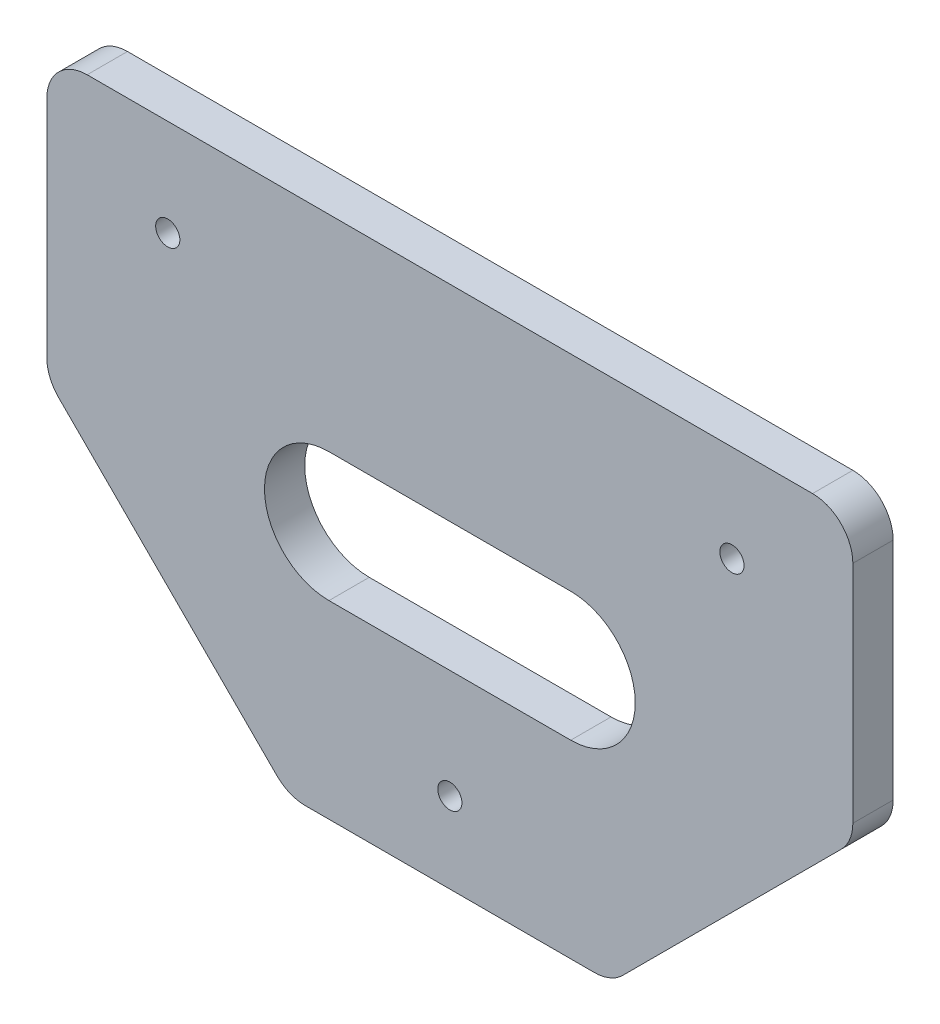
ISO-10303-21;
HEADER;
FILE_DESCRIPTION(('STEP AP214'),'2;1');
FILE_NAME('part.step','',(''),(''),'','','');
FILE_SCHEMA(('AUTOMOTIVE_DESIGN { 1 0 10303 214 1 1 1 1 }'));
ENDSEC;
DATA;
#1=APPLICATION_CONTEXT('core data for automotive mechanical design processes');
#2=APPLICATION_PROTOCOL_DEFINITION('international standard','automotive_design',2000,#1);
#3=PRODUCT_CONTEXT('',#1,'mechanical');
#4=PRODUCT('Part','Part','',(#3));
#5=PRODUCT_RELATED_PRODUCT_CATEGORY('part','',(#4));
#6=PRODUCT_DEFINITION_FORMATION('','',#4);
#7=PRODUCT_DEFINITION_CONTEXT('part definition',#1,'design');
#8=PRODUCT_DEFINITION('design','',#6,#7);
#9=PRODUCT_DEFINITION_SHAPE('','',#8);
#10=(LENGTH_UNIT() NAMED_UNIT(*) SI_UNIT(.MILLI.,.METRE.));
#11=(NAMED_UNIT(*) PLANE_ANGLE_UNIT() SI_UNIT($,.RADIAN.));
#12=(NAMED_UNIT(*) SI_UNIT($,.STERADIAN.) SOLID_ANGLE_UNIT());
#13=UNCERTAINTY_MEASURE_WITH_UNIT(LENGTH_MEASURE(1.E-05),#10,'distance_accuracy_value','');
#14=(GEOMETRIC_REPRESENTATION_CONTEXT(3) GLOBAL_UNCERTAINTY_ASSIGNED_CONTEXT((#13)) GLOBAL_UNIT_ASSIGNED_CONTEXT((#10,
#11,#12)) REPRESENTATION_CONTEXT('',''));
#15=CARTESIAN_POINT('',(0.,0.,0.));
#16=DIRECTION('',(0.,0.,1.));
#17=DIRECTION('',(1.,0.,0.));
#18=AXIS2_PLACEMENT_3D('',#15,#16,#17);
#19=CARTESIAN_POINT('',(100.,40.,5.));
#20=DIRECTION('',(-1.,0.,0.));
#21=DIRECTION('',(0.,0.,1.));
#22=AXIS2_PLACEMENT_3D('',#19,#20,#21);
#23=PLANE('',#22);
#24=DIRECTION('',(0.,1.,0.));
#25=VECTOR('',#24,1.);
#26=CARTESIAN_POINT('',(100.,40.,0.));
#27=LINE('',#26,#25);
#28=CARTESIAN_POINT('',(100.,42.0710678118655,0.));
#29=VERTEX_POINT('',#28);
#30=CARTESIAN_POINT('',(100.,70.,0.));
#31=VERTEX_POINT('',#30);
#32=EDGE_CURVE('E207',#29,#31,#27,.T.);
#33=ORIENTED_EDGE('',*,*,#32,.T.);
#34=DIRECTION('',(0.,0.,-1.));
#35=VECTOR('',#34,1.);
#36=CARTESIAN_POINT('',(100.,70.,5.));
#37=LINE('',#36,#35);
#38=CARTESIAN_POINT('',(100.,70.,5.));
#39=VERTEX_POINT('',#38);
#40=EDGE_CURVE('E267',#31,#39,#37,.F.);
#41=ORIENTED_EDGE('',*,*,#40,.T.);
#42=DIRECTION('',(0.,1.,0.));
#43=VECTOR('',#42,1.);
#44=CARTESIAN_POINT('',(100.,40.,5.));
#45=LINE('',#44,#43);
#46=CARTESIAN_POINT('',(100.,42.0710678118655,5.));
#47=VERTEX_POINT('',#46);
#48=EDGE_CURVE('E191',#47,#39,#45,.T.);
#49=ORIENTED_EDGE('',*,*,#48,.F.);
#50=DIRECTION('',(0.,0.,-1.));
#51=VECTOR('',#50,1.);
#52=CARTESIAN_POINT('',(100.,42.0710678118655,5.));
#53=LINE('',#52,#51);
#54=EDGE_CURVE('E231',#47,#29,#53,.T.);
#55=ORIENTED_EDGE('',*,*,#54,.T.);
#56=EDGE_LOOP('',(#33,#41,#49,#55));
#57=FACE_BOUND('',#56,.T.);
#58=ADVANCED_FACE('F33',(#57),#23,.F.);
#59=CARTESIAN_POINT('',(0.,75.,5.));
#60=DIRECTION('',(0.,-1.,0.));
#61=DIRECTION('',(0.,0.,-1.));
#62=AXIS2_PLACEMENT_3D('',#59,#60,#61);
#63=PLANE('',#62);
#64=DIRECTION('',(-1.,0.,0.));
#65=VECTOR('',#64,1.);
#66=CARTESIAN_POINT('',(0.,75.,0.));
#67=LINE('',#66,#65);
#68=CARTESIAN_POINT('',(95.,75.,0.));
#69=VERTEX_POINT('',#68);
#70=CARTESIAN_POINT('',(5.,75.,0.));
#71=VERTEX_POINT('',#70);
#72=EDGE_CURVE('E210',#69,#71,#67,.T.);
#73=ORIENTED_EDGE('',*,*,#72,.T.);
#74=DIRECTION('',(0.,0.,-1.));
#75=VECTOR('',#74,1.);
#76=CARTESIAN_POINT('',(5.,75.,5.));
#77=LINE('',#76,#75);
#78=CARTESIAN_POINT('',(5.,75.,5.));
#79=VERTEX_POINT('',#78);
#80=EDGE_CURVE('E41',#71,#79,#77,.F.);
#81=ORIENTED_EDGE('',*,*,#80,.T.);
#82=DIRECTION('',(-1.,0.,0.));
#83=VECTOR('',#82,1.);
#84=CARTESIAN_POINT('',(0.,75.,5.));
#85=LINE('',#84,#83);
#86=CARTESIAN_POINT('',(95.,75.,5.));
#87=VERTEX_POINT('',#86);
#88=EDGE_CURVE('E194',#87,#79,#85,.T.);
#89=ORIENTED_EDGE('',*,*,#88,.F.);
#90=DIRECTION('',(0.,0.,-1.));
#91=VECTOR('',#90,1.);
#92=CARTESIAN_POINT('',(95.,75.,5.));
#93=LINE('',#92,#91);
#94=EDGE_CURVE('E262',#87,#69,#93,.T.);
#95=ORIENTED_EDGE('',*,*,#94,.T.);
#96=EDGE_LOOP('',(#73,#81,#89,#95));
#97=FACE_BOUND('',#96,.T.);
#98=ADVANCED_FACE('F322',(#97),#63,.F.);
#99=CARTESIAN_POINT('',(0.,40.,5.));
#100=DIRECTION('',(1.,0.,0.));
#101=DIRECTION('',(0.,0.,-1.));
#102=AXIS2_PLACEMENT_3D('',#99,#100,#101);
#103=PLANE('',#102);
#104=DIRECTION('',(0.,-1.,0.));
#105=VECTOR('',#104,1.);
#106=CARTESIAN_POINT('',(0.,40.,5.));
#107=LINE('',#106,#105);
#108=CARTESIAN_POINT('',(0.,70.,5.));
#109=VERTEX_POINT('',#108);
#110=CARTESIAN_POINT('',(0.,42.0710678118655,5.));
#111=VERTEX_POINT('',#110);
#112=EDGE_CURVE('E197',#109,#111,#107,.T.);
#113=ORIENTED_EDGE('',*,*,#112,.F.);
#114=DIRECTION('',(0.,0.,-1.));
#115=VECTOR('',#114,1.);
#116=CARTESIAN_POINT('',(0.,70.,5.));
#117=LINE('',#116,#115);
#118=CARTESIAN_POINT('',(0.,70.,0.));
#119=VERTEX_POINT('',#118);
#120=EDGE_CURVE('E271',#109,#119,#117,.T.);
#121=ORIENTED_EDGE('',*,*,#120,.T.);
#122=DIRECTION('',(0.,-1.,0.));
#123=VECTOR('',#122,1.);
#124=CARTESIAN_POINT('',(0.,40.,0.));
#125=LINE('',#124,#123);
#126=CARTESIAN_POINT('',(0.,42.0710678118655,0.));
#127=VERTEX_POINT('',#126);
#128=EDGE_CURVE('E213',#119,#127,#125,.T.);
#129=ORIENTED_EDGE('',*,*,#128,.T.);
#130=DIRECTION('',(0.,0.,-1.));
#131=VECTOR('',#130,1.);
#132=CARTESIAN_POINT('',(0.,42.0710678118655,5.));
#133=LINE('',#132,#131);
#134=EDGE_CURVE('E226',#127,#111,#133,.F.);
#135=ORIENTED_EDGE('',*,*,#134,.T.);
#136=EDGE_LOOP('',(#113,#121,#129,#135));
#137=FACE_BOUND('',#136,.T.);
#138=ADVANCED_FACE('F277',(#137),#103,.F.);
#139=CARTESIAN_POINT('',(0.,40.,5.));
#140=DIRECTION('',(0.707106781186548,0.707106781186548,0.));
#141=DIRECTION('',(-0.707106781186548,0.707106781186548,0.));
#142=AXIS2_PLACEMENT_3D('',#139,#140,#141);
#143=PLANE('',#142);
#144=DIRECTION('',(0.707106781186547,-0.707106781186547,0.));
#145=VECTOR('',#144,1.);
#146=CARTESIAN_POINT('',(0.,40.,0.));
#147=LINE('',#146,#145);
#148=CARTESIAN_POINT('',(1.46446609406726,38.5355339059327,0.));
#149=VERTEX_POINT('',#148);
#150=CARTESIAN_POINT('',(28.5355339059327,11.4644660940673,0.));
#151=VERTEX_POINT('',#150);
#152=EDGE_CURVE('E215',#149,#151,#147,.T.);
#153=ORIENTED_EDGE('',*,*,#152,.T.);
#154=DIRECTION('',(0.,0.,-1.));
#155=VECTOR('',#154,1.);
#156=CARTESIAN_POINT('',(28.5355339059327,11.4644660940673,5.));
#157=LINE('',#156,#155);
#158=CARTESIAN_POINT('',(28.5355339059327,11.4644660940673,5.));
#159=VERTEX_POINT('',#158);
#160=EDGE_CURVE('E258',#151,#159,#157,.F.);
#161=ORIENTED_EDGE('',*,*,#160,.T.);
#162=DIRECTION('',(0.707106781186547,-0.707106781186547,0.));
#163=VECTOR('',#162,1.);
#164=CARTESIAN_POINT('',(0.,40.,5.));
#165=LINE('',#164,#163);
#166=CARTESIAN_POINT('',(1.46446609406726,38.5355339059327,5.));
#167=VERTEX_POINT('',#166);
#168=EDGE_CURVE('E199',#167,#159,#165,.T.);
#169=ORIENTED_EDGE('',*,*,#168,.F.);
#170=DIRECTION('',(0.,0.,-1.));
#171=VECTOR('',#170,1.);
#172=CARTESIAN_POINT('',(1.46446609406726,38.5355339059327,5.));
#173=LINE('',#172,#171);
#174=EDGE_CURVE('E206',#167,#149,#173,.T.);
#175=ORIENTED_EDGE('',*,*,#174,.T.);
#176=EDGE_LOOP('',(#153,#161,#169,#175));
#177=FACE_BOUND('',#176,.T.);
#178=ADVANCED_FACE('F291',(#177),#143,.F.);
#179=CARTESIAN_POINT('',(30.,10.,5.));
#180=DIRECTION('',(0.,1.,0.));
#181=DIRECTION('',(0.,0.,1.));
#182=AXIS2_PLACEMENT_3D('',#179,#180,#181);
#183=PLANE('',#182);
#184=DIRECTION('',(1.,0.,0.));
#185=VECTOR('',#184,1.);
#186=CARTESIAN_POINT('',(30.,10.,5.));
#187=LINE('',#186,#185);
#188=CARTESIAN_POINT('',(32.0710678118655,10.,5.));
#189=VERTEX_POINT('',#188);
#190=CARTESIAN_POINT('',(67.9289321881345,10.,5.));
#191=VERTEX_POINT('',#190);
#192=EDGE_CURVE('E202',#189,#191,#187,.T.);
#193=ORIENTED_EDGE('',*,*,#192,.F.);
#194=DIRECTION('',(0.,0.,-1.));
#195=VECTOR('',#194,1.);
#196=CARTESIAN_POINT('',(32.0710678118655,10.,5.));
#197=LINE('',#196,#195);
#198=CARTESIAN_POINT('',(32.0710678118655,10.,0.));
#199=VERTEX_POINT('',#198);
#200=EDGE_CURVE('E253',#189,#199,#197,.T.);
#201=ORIENTED_EDGE('',*,*,#200,.T.);
#202=DIRECTION('',(1.,0.,0.));
#203=VECTOR('',#202,1.);
#204=CARTESIAN_POINT('',(30.,10.,0.));
#205=LINE('',#204,#203);
#206=CARTESIAN_POINT('',(67.9289321881345,10.,0.));
#207=VERTEX_POINT('',#206);
#208=EDGE_CURVE('E218',#199,#207,#205,.T.);
#209=ORIENTED_EDGE('',*,*,#208,.T.);
#210=DIRECTION('',(0.,0.,-1.));
#211=VECTOR('',#210,1.);
#212=CARTESIAN_POINT('',(67.9289321881345,10.,5.));
#213=LINE('',#212,#211);
#214=EDGE_CURVE('E248',#207,#191,#213,.F.);
#215=ORIENTED_EDGE('',*,*,#214,.T.);
#216=EDGE_LOOP('',(#193,#201,#209,#215));
#217=FACE_BOUND('',#216,.T.);
#218=ADVANCED_FACE('F298',(#217),#183,.F.);
#219=CARTESIAN_POINT('',(100.,40.,5.));
#220=DIRECTION('',(-0.707106781186548,0.707106781186548,0.));
#221=DIRECTION('',(-0.707106781186548,-0.707106781186548,0.));
#222=AXIS2_PLACEMENT_3D('',#219,#220,#221);
#223=PLANE('',#222);
#224=DIRECTION('',(0.707106781186547,0.707106781186547,0.));
#225=VECTOR('',#224,1.);
#226=CARTESIAN_POINT('',(100.,40.,5.));
#227=LINE('',#226,#225);
#228=CARTESIAN_POINT('',(71.4644660940673,11.4644660940673,5.));
#229=VERTEX_POINT('',#228);
#230=CARTESIAN_POINT('',(98.5355339059327,38.5355339059327,5.));
#231=VERTEX_POINT('',#230);
#232=EDGE_CURVE('E204',#229,#231,#227,.T.);
#233=ORIENTED_EDGE('',*,*,#232,.F.);
#234=DIRECTION('',(0.,0.,-1.));
#235=VECTOR('',#234,1.);
#236=CARTESIAN_POINT('',(71.4644660940673,11.4644660940673,5.));
#237=LINE('',#236,#235);
#238=CARTESIAN_POINT('',(71.4644660940673,11.4644660940673,0.));
#239=VERTEX_POINT('',#238);
#240=EDGE_CURVE('E242',#229,#239,#237,.T.);
#241=ORIENTED_EDGE('',*,*,#240,.T.);
#242=DIRECTION('',(0.707106781186547,0.707106781186547,0.));
#243=VECTOR('',#242,1.);
#244=CARTESIAN_POINT('',(100.,40.,0.));
#245=LINE('',#244,#243);
#246=CARTESIAN_POINT('',(98.5355339059327,38.5355339059327,0.));
#247=VERTEX_POINT('',#246);
#248=EDGE_CURVE('E195',#239,#247,#245,.T.);
#249=ORIENTED_EDGE('',*,*,#248,.T.);
#250=DIRECTION('',(0.,0.,-1.));
#251=VECTOR('',#250,1.);
#252=CARTESIAN_POINT('',(98.5355339059327,38.5355339059327,5.));
#253=LINE('',#252,#251);
#254=EDGE_CURVE('E237',#247,#231,#253,.F.);
#255=ORIENTED_EDGE('',*,*,#254,.T.);
#256=EDGE_LOOP('',(#233,#241,#249,#255));
#257=FACE_BOUND('',#256,.T.);
#258=ADVANCED_FACE('F307',(#257),#223,.F.);
#259=CARTESIAN_POINT('',(0.,0.,5.));
#260=DIRECTION('',(0.,0.,-1.));
#261=DIRECTION('',(-1.,0.,0.));
#262=AXIS2_PLACEMENT_3D('',#259,#260,#261);
#263=PLANE('',#262);
#264=CARTESIAN_POINT('',(50.,20.,5.));
#265=DIRECTION('',(0.,0.,1.));
#266=DIRECTION('',(1.,0.,0.));
#267=AXIS2_PLACEMENT_3D('',#264,#265,#266);
#268=CIRCLE('',#267,1.49999999999999);
#269=CARTESIAN_POINT('',(51.5,20.,5.));
#270=VERTEX_POINT('',#269);
#271=EDGE_CURVE('E504',#270,#270,#268,.T.);
#272=ORIENTED_EDGE('',*,*,#271,.F.);
#273=EDGE_LOOP('',(#272));
#274=FACE_BOUND('',#273,.T.);
#275=CARTESIAN_POINT('',(85.,63.,5.));
#276=DIRECTION('',(0.,0.,1.));
#277=DIRECTION('',(1.,0.,0.));
#278=AXIS2_PLACEMENT_3D('',#275,#276,#277);
#279=CIRCLE('',#278,1.5);
#280=CARTESIAN_POINT('',(86.5,63.,5.));
#281=VERTEX_POINT('',#280);
#282=EDGE_CURVE('E509',#281,#281,#279,.T.);
#283=ORIENTED_EDGE('',*,*,#282,.F.);
#284=EDGE_LOOP('',(#283));
#285=FACE_BOUND('',#284,.T.);
#286=CARTESIAN_POINT('',(15.,63.,5.));
#287=DIRECTION('',(0.,0.,1.));
#288=DIRECTION('',(1.,0.,0.));
#289=AXIS2_PLACEMENT_3D('',#286,#287,#288);
#290=CIRCLE('',#289,1.50000000000001);
#291=CARTESIAN_POINT('',(16.5,63.,5.));
#292=VERTEX_POINT('',#291);
#293=EDGE_CURVE('E176',#292,#292,#290,.T.);
#294=ORIENTED_EDGE('',*,*,#293,.F.);
#295=EDGE_LOOP('',(#294));
#296=FACE_BOUND('',#295,.T.);
#297=DIRECTION('',(1.,0.,0.));
#298=VECTOR('',#297,1.);
#299=CARTESIAN_POINT('',(35.,33.5,5.));
#300=LINE('',#299,#298);
#301=CARTESIAN_POINT('',(35.,33.5,5.));
#302=VERTEX_POINT('',#301);
#303=CARTESIAN_POINT('',(65.,33.5,5.));
#304=VERTEX_POINT('',#303);
#305=EDGE_CURVE('E182',#302,#304,#300,.T.);
#306=ORIENTED_EDGE('',*,*,#305,.F.);
#307=CARTESIAN_POINT('',(35.,41.5,5.));
#308=DIRECTION('',(0.,0.,1.));
#309=DIRECTION('',(1.,0.,0.));
#310=AXIS2_PLACEMENT_3D('',#307,#308,#309);
#311=CIRCLE('',#310,7.99999999999999);
#312=CARTESIAN_POINT('',(35.,49.5,5.));
#313=VERTEX_POINT('',#312);
#314=EDGE_CURVE('E153',#313,#302,#311,.T.);
#315=ORIENTED_EDGE('',*,*,#314,.F.);
#316=DIRECTION('',(-1.,0.,0.));
#317=VECTOR('',#316,1.);
#318=CARTESIAN_POINT('',(35.,49.5,5.));
#319=LINE('',#318,#317);
#320=CARTESIAN_POINT('',(65.,49.5,5.));
#321=VERTEX_POINT('',#320);
#322=EDGE_CURVE('E170',#321,#313,#319,.T.);
#323=ORIENTED_EDGE('',*,*,#322,.F.);
#324=CARTESIAN_POINT('',(65.,41.5,5.));
#325=DIRECTION('',(0.,0.,1.));
#326=DIRECTION('',(1.,0.,0.));
#327=AXIS2_PLACEMENT_3D('',#324,#325,#326);
#328=CIRCLE('',#327,8.);
#329=EDGE_CURVE('E173',#304,#321,#328,.T.);
#330=ORIENTED_EDGE('',*,*,#329,.F.);
#331=EDGE_LOOP('',(#306,#315,#323,#330));
#332=FACE_BOUND('',#331,.T.);
#333=ORIENTED_EDGE('',*,*,#88,.T.);
#334=CARTESIAN_POINT('',(5.,70.,5.));
#335=DIRECTION('',(0.,0.,-1.));
#336=DIRECTION('',(-1.,0.,0.));
#337=AXIS2_PLACEMENT_3D('',#334,#335,#336);
#338=CIRCLE('',#337,5.);
#339=EDGE_CURVE('E11',#79,#109,#338,.F.);
#340=ORIENTED_EDGE('',*,*,#339,.T.);
#341=ORIENTED_EDGE('',*,*,#112,.T.);
#342=CARTESIAN_POINT('',(5.,42.0710678118655,5.));
#343=DIRECTION('',(0.,0.,-1.));
#344=DIRECTION('',(-1.,0.,0.));
#345=AXIS2_PLACEMENT_3D('',#342,#343,#344);
#346=CIRCLE('',#345,5.);
#347=EDGE_CURVE('E229',#111,#167,#346,.F.);
#348=ORIENTED_EDGE('',*,*,#347,.T.);
#349=ORIENTED_EDGE('',*,*,#168,.T.);
#350=CARTESIAN_POINT('',(32.0710678118655,15.,5.));
#351=DIRECTION('',(0.,0.,-1.));
#352=DIRECTION('',(-1.,0.,0.));
#353=AXIS2_PLACEMENT_3D('',#350,#351,#352);
#354=CIRCLE('',#353,5.);
#355=EDGE_CURVE('E260',#159,#189,#354,.F.);
#356=ORIENTED_EDGE('',*,*,#355,.T.);
#357=ORIENTED_EDGE('',*,*,#192,.T.);
#358=CARTESIAN_POINT('',(67.9289321881345,15.,5.));
#359=DIRECTION('',(0.,0.,-1.));
#360=DIRECTION('',(-1.,0.,0.));
#361=AXIS2_PLACEMENT_3D('',#358,#359,#360);
#362=CIRCLE('',#361,5.);
#363=EDGE_CURVE('E251',#191,#229,#362,.F.);
#364=ORIENTED_EDGE('',*,*,#363,.T.);
#365=ORIENTED_EDGE('',*,*,#232,.T.);
#366=CARTESIAN_POINT('',(95.,42.0710678118655,5.));
#367=DIRECTION('',(0.,0.,-1.));
#368=DIRECTION('',(-1.,0.,0.));
#369=AXIS2_PLACEMENT_3D('',#366,#367,#368);
#370=CIRCLE('',#369,5.);
#371=EDGE_CURVE('E240',#231,#47,#370,.F.);
#372=ORIENTED_EDGE('',*,*,#371,.T.);
#373=ORIENTED_EDGE('',*,*,#48,.T.);
#374=CARTESIAN_POINT('',(95.,70.,5.));
#375=DIRECTION('',(0.,0.,-1.));
#376=DIRECTION('',(-1.,0.,0.));
#377=AXIS2_PLACEMENT_3D('',#374,#375,#376);
#378=CIRCLE('',#377,5.);
#379=EDGE_CURVE('E269',#39,#87,#378,.F.);
#380=ORIENTED_EDGE('',*,*,#379,.T.);
#381=EDGE_LOOP('',(#333,#340,#341,#348,#349,#356,#357,#364,#365,#372,#373,#380));
#382=FACE_BOUND('',#381,.T.);
#383=ADVANCED_FACE('F288',(#274,#285,#296,#332,#382),#263,.F.);
#384=CARTESIAN_POINT('',(0.,0.,0.));
#385=DIRECTION('',(0.,0.,-1.));
#386=DIRECTION('',(-1.,0.,0.));
#387=AXIS2_PLACEMENT_3D('',#384,#385,#386);
#388=PLANE('',#387);
#389=CARTESIAN_POINT('',(50.,20.,0.));
#390=DIRECTION('',(0.,0.,1.));
#391=DIRECTION('',(1.,0.,0.));
#392=AXIS2_PLACEMENT_3D('',#389,#390,#391);
#393=CIRCLE('',#392,1.49999999999999);
#394=CARTESIAN_POINT('',(51.5,20.,0.));
#395=VERTEX_POINT('',#394);
#396=EDGE_CURVE('E211',#395,#395,#393,.T.);
#397=ORIENTED_EDGE('',*,*,#396,.T.);
#398=EDGE_LOOP('',(#397));
#399=FACE_BOUND('',#398,.T.);
#400=CARTESIAN_POINT('',(85.,63.,0.));
#401=DIRECTION('',(0.,0.,1.));
#402=DIRECTION('',(1.,0.,0.));
#403=AXIS2_PLACEMENT_3D('',#400,#401,#402);
#404=CIRCLE('',#403,1.5);
#405=CARTESIAN_POINT('',(86.5,63.,0.));
#406=VERTEX_POINT('',#405);
#407=EDGE_CURVE('E505',#406,#406,#404,.T.);
#408=ORIENTED_EDGE('',*,*,#407,.T.);
#409=EDGE_LOOP('',(#408));
#410=FACE_BOUND('',#409,.T.);
#411=CARTESIAN_POINT('',(15.,63.,0.));
#412=DIRECTION('',(0.,0.,1.));
#413=DIRECTION('',(1.,0.,0.));
#414=AXIS2_PLACEMENT_3D('',#411,#412,#413);
#415=CIRCLE('',#414,1.50000000000001);
#416=CARTESIAN_POINT('',(16.5,63.,0.));
#417=VERTEX_POINT('',#416);
#418=EDGE_CURVE('E513',#417,#417,#415,.T.);
#419=ORIENTED_EDGE('',*,*,#418,.T.);
#420=EDGE_LOOP('',(#419));
#421=FACE_BOUND('',#420,.T.);
#422=CARTESIAN_POINT('',(35.,41.5,0.));
#423=DIRECTION('',(0.,0.,1.));
#424=DIRECTION('',(1.,0.,0.));
#425=AXIS2_PLACEMENT_3D('',#422,#423,#424);
#426=CIRCLE('',#425,7.99999999999999);
#427=CARTESIAN_POINT('',(35.,49.5,0.));
#428=VERTEX_POINT('',#427);
#429=CARTESIAN_POINT('',(35.,33.5,0.));
#430=VERTEX_POINT('',#429);
#431=EDGE_CURVE('E150',#428,#430,#426,.T.);
#432=ORIENTED_EDGE('',*,*,#431,.T.);
#433=DIRECTION('',(1.,0.,0.));
#434=VECTOR('',#433,1.);
#435=CARTESIAN_POINT('',(35.,33.5,0.));
#436=LINE('',#435,#434);
#437=CARTESIAN_POINT('',(65.,33.5,0.));
#438=VERTEX_POINT('',#437);
#439=EDGE_CURVE('E162',#430,#438,#436,.T.);
#440=ORIENTED_EDGE('',*,*,#439,.T.);
#441=CARTESIAN_POINT('',(65.,41.5,0.));
#442=DIRECTION('',(0.,0.,1.));
#443=DIRECTION('',(1.,0.,0.));
#444=AXIS2_PLACEMENT_3D('',#441,#442,#443);
#445=CIRCLE('',#444,8.);
#446=CARTESIAN_POINT('',(65.,49.5,0.));
#447=VERTEX_POINT('',#446);
#448=EDGE_CURVE('E166',#438,#447,#445,.T.);
#449=ORIENTED_EDGE('',*,*,#448,.T.);
#450=DIRECTION('',(-1.,0.,0.));
#451=VECTOR('',#450,1.);
#452=CARTESIAN_POINT('',(35.,49.5,0.));
#453=LINE('',#452,#451);
#454=EDGE_CURVE('E158',#447,#428,#453,.T.);
#455=ORIENTED_EDGE('',*,*,#454,.T.);
#456=EDGE_LOOP('',(#432,#440,#449,#455));
#457=FACE_BOUND('',#456,.T.);
#458=ORIENTED_EDGE('',*,*,#128,.F.);
#459=CARTESIAN_POINT('',(5.,70.,0.));
#460=DIRECTION('',(0.,0.,-1.));
#461=DIRECTION('',(-1.,0.,0.));
#462=AXIS2_PLACEMENT_3D('',#459,#460,#461);
#463=CIRCLE('',#462,5.);
#464=EDGE_CURVE('E55',#119,#71,#463,.T.);
#465=ORIENTED_EDGE('',*,*,#464,.T.);
#466=ORIENTED_EDGE('',*,*,#72,.F.);
#467=CARTESIAN_POINT('',(95.,70.,0.));
#468=DIRECTION('',(0.,0.,-1.));
#469=DIRECTION('',(-1.,0.,0.));
#470=AXIS2_PLACEMENT_3D('',#467,#468,#469);
#471=CIRCLE('',#470,5.);
#472=EDGE_CURVE('E265',#69,#31,#471,.T.);
#473=ORIENTED_EDGE('',*,*,#472,.T.);
#474=ORIENTED_EDGE('',*,*,#32,.F.);
#475=CARTESIAN_POINT('',(95.,42.0710678118655,0.));
#476=DIRECTION('',(0.,0.,-1.));
#477=DIRECTION('',(-1.,0.,0.));
#478=AXIS2_PLACEMENT_3D('',#475,#476,#477);
#479=CIRCLE('',#478,5.);
#480=EDGE_CURVE('E234',#29,#247,#479,.T.);
#481=ORIENTED_EDGE('',*,*,#480,.T.);
#482=ORIENTED_EDGE('',*,*,#248,.F.);
#483=CARTESIAN_POINT('',(67.9289321881345,15.,0.));
#484=DIRECTION('',(0.,0.,-1.));
#485=DIRECTION('',(-1.,0.,0.));
#486=AXIS2_PLACEMENT_3D('',#483,#484,#485);
#487=CIRCLE('',#486,5.);
#488=EDGE_CURVE('E245',#239,#207,#487,.T.);
#489=ORIENTED_EDGE('',*,*,#488,.T.);
#490=ORIENTED_EDGE('',*,*,#208,.F.);
#491=CARTESIAN_POINT('',(32.0710678118655,15.,0.));
#492=DIRECTION('',(0.,0.,-1.));
#493=DIRECTION('',(-1.,0.,0.));
#494=AXIS2_PLACEMENT_3D('',#491,#492,#493);
#495=CIRCLE('',#494,5.);
#496=EDGE_CURVE('E256',#199,#151,#495,.T.);
#497=ORIENTED_EDGE('',*,*,#496,.T.);
#498=ORIENTED_EDGE('',*,*,#152,.F.);
#499=CARTESIAN_POINT('',(5.,42.0710678118655,0.));
#500=DIRECTION('',(0.,0.,-1.));
#501=DIRECTION('',(-1.,0.,0.));
#502=AXIS2_PLACEMENT_3D('',#499,#500,#501);
#503=CIRCLE('',#502,5.);
#504=EDGE_CURVE('E223',#149,#127,#503,.T.);
#505=ORIENTED_EDGE('',*,*,#504,.T.);
#506=EDGE_LOOP('',(#458,#465,#466,#473,#474,#481,#482,#489,#490,#497,#498,#505));
#507=FACE_BOUND('',#506,.T.);
#508=ADVANCED_FACE('F168',(#399,#410,#421,#457,#507),#388,.T.);
#509=CARTESIAN_POINT('',(35.,41.5,0.));
#510=DIRECTION('',(0.,0.,1.));
#511=DIRECTION('',(1.,0.,0.));
#512=AXIS2_PLACEMENT_3D('',#509,#510,#511);
#513=CYLINDRICAL_SURFACE('',#512,7.99999999999999);
#514=ORIENTED_EDGE('',*,*,#314,.T.);
#515=DIRECTION('',(0.,0.,1.));
#516=VECTOR('',#515,1.);
#517=CARTESIAN_POINT('',(35.,33.5,0.));
#518=LINE('',#517,#516);
#519=EDGE_CURVE('E146',#430,#302,#518,.T.);
#520=ORIENTED_EDGE('',*,*,#519,.F.);
#521=ORIENTED_EDGE('',*,*,#431,.F.);
#522=DIRECTION('',(0.,0.,1.));
#523=VECTOR('',#522,1.);
#524=CARTESIAN_POINT('',(35.,49.5,0.));
#525=LINE('',#524,#523);
#526=EDGE_CURVE('E186',#428,#313,#525,.T.);
#527=ORIENTED_EDGE('',*,*,#526,.T.);
#528=EDGE_LOOP('',(#514,#520,#521,#527));
#529=FACE_BOUND('',#528,.T.);
#530=ADVANCED_FACE('F148',(#529),#513,.F.);
#531=CARTESIAN_POINT('',(35.,49.5,0.));
#532=DIRECTION('',(0.,1.,0.));
#533=DIRECTION('',(-1.,0.,0.));
#534=AXIS2_PLACEMENT_3D('',#531,#532,#533);
#535=PLANE('',#534);
#536=ORIENTED_EDGE('',*,*,#322,.T.);
#537=ORIENTED_EDGE('',*,*,#526,.F.);
#538=ORIENTED_EDGE('',*,*,#454,.F.);
#539=DIRECTION('',(0.,0.,1.));
#540=VECTOR('',#539,1.);
#541=CARTESIAN_POINT('',(65.,49.5,0.));
#542=LINE('',#541,#540);
#543=EDGE_CURVE('E188',#447,#321,#542,.T.);
#544=ORIENTED_EDGE('',*,*,#543,.T.);
#545=EDGE_LOOP('',(#536,#537,#538,#544));
#546=FACE_BOUND('',#545,.T.);
#547=ADVANCED_FACE('F402',(#546),#535,.F.);
#548=CARTESIAN_POINT('',(65.,41.5,0.));
#549=DIRECTION('',(0.,0.,1.));
#550=DIRECTION('',(1.,0.,0.));
#551=AXIS2_PLACEMENT_3D('',#548,#549,#550);
#552=CYLINDRICAL_SURFACE('',#551,8.);
#553=ORIENTED_EDGE('',*,*,#329,.T.);
#554=ORIENTED_EDGE('',*,*,#543,.F.);
#555=ORIENTED_EDGE('',*,*,#448,.F.);
#556=DIRECTION('',(0.,0.,1.));
#557=VECTOR('',#556,1.);
#558=CARTESIAN_POINT('',(65.,33.5,0.));
#559=LINE('',#558,#557);
#560=EDGE_CURVE('E157',#438,#304,#559,.T.);
#561=ORIENTED_EDGE('',*,*,#560,.T.);
#562=EDGE_LOOP('',(#553,#554,#555,#561));
#563=FACE_BOUND('',#562,.T.);
#564=ADVANCED_FACE('F408',(#563),#552,.F.);
#565=CARTESIAN_POINT('',(35.,33.5,0.));
#566=DIRECTION('',(0.,-1.,0.));
#567=DIRECTION('',(1.,0.,0.));
#568=AXIS2_PLACEMENT_3D('',#565,#566,#567);
#569=PLANE('',#568);
#570=ORIENTED_EDGE('',*,*,#305,.T.);
#571=ORIENTED_EDGE('',*,*,#560,.F.);
#572=ORIENTED_EDGE('',*,*,#439,.F.);
#573=ORIENTED_EDGE('',*,*,#519,.T.);
#574=EDGE_LOOP('',(#570,#571,#572,#573));
#575=FACE_BOUND('',#574,.T.);
#576=ADVANCED_FACE('F163',(#575),#569,.F.);
#577=CARTESIAN_POINT('',(15.,63.,0.));
#578=DIRECTION('',(0.,0.,1.));
#579=DIRECTION('',(1.,0.,0.));
#580=AXIS2_PLACEMENT_3D('',#577,#578,#579);
#581=CYLINDRICAL_SURFACE('',#580,1.50000000000001);
#582=ORIENTED_EDGE('',*,*,#418,.F.);
#583=EDGE_LOOP('',(#582));
#584=FACE_BOUND('',#583,.T.);
#585=ORIENTED_EDGE('',*,*,#293,.T.);
#586=EDGE_LOOP('',(#585));
#587=FACE_BOUND('',#586,.T.);
#588=ADVANCED_FACE('F423',(#584,#587),#581,.F.);
#589=CARTESIAN_POINT('',(85.,63.,0.));
#590=DIRECTION('',(0.,0.,1.));
#591=DIRECTION('',(1.,0.,0.));
#592=AXIS2_PLACEMENT_3D('',#589,#590,#591);
#593=CYLINDRICAL_SURFACE('',#592,1.5);
#594=ORIENTED_EDGE('',*,*,#407,.F.);
#595=EDGE_LOOP('',(#594));
#596=FACE_BOUND('',#595,.T.);
#597=ORIENTED_EDGE('',*,*,#282,.T.);
#598=EDGE_LOOP('',(#597));
#599=FACE_BOUND('',#598,.T.);
#600=ADVANCED_FACE('F430',(#596,#599),#593,.F.);
#601=CARTESIAN_POINT('',(50.,20.,0.));
#602=DIRECTION('',(0.,0.,1.));
#603=DIRECTION('',(1.,0.,0.));
#604=AXIS2_PLACEMENT_3D('',#601,#602,#603);
#605=CYLINDRICAL_SURFACE('',#604,1.49999999999999);
#606=ORIENTED_EDGE('',*,*,#396,.F.);
#607=EDGE_LOOP('',(#606));
#608=FACE_BOUND('',#607,.T.);
#609=ORIENTED_EDGE('',*,*,#271,.T.);
#610=EDGE_LOOP('',(#609));
#611=FACE_BOUND('',#610,.T.);
#612=ADVANCED_FACE('F337',(#608,#611),#605,.F.);
#613=CARTESIAN_POINT('',(5.,42.0710678118655,5.));
#614=DIRECTION('',(0.,0.,-1.));
#615=DIRECTION('',(-1.,0.,0.));
#616=AXIS2_PLACEMENT_3D('',#613,#614,#615);
#617=CYLINDRICAL_SURFACE('',#616,5.);
#618=ORIENTED_EDGE('',*,*,#347,.F.);
#619=ORIENTED_EDGE('',*,*,#134,.F.);
#620=ORIENTED_EDGE('',*,*,#504,.F.);
#621=ORIENTED_EDGE('',*,*,#174,.F.);
#622=EDGE_LOOP('',(#618,#619,#620,#621));
#623=FACE_BOUND('',#622,.T.);
#624=ADVANCED_FACE('F285',(#623),#617,.T.);
#625=CARTESIAN_POINT('',(95.,42.0710678118655,5.));
#626=DIRECTION('',(0.,0.,-1.));
#627=DIRECTION('',(-1.,0.,0.));
#628=AXIS2_PLACEMENT_3D('',#625,#626,#627);
#629=CYLINDRICAL_SURFACE('',#628,5.);
#630=ORIENTED_EDGE('',*,*,#371,.F.);
#631=ORIENTED_EDGE('',*,*,#254,.F.);
#632=ORIENTED_EDGE('',*,*,#480,.F.);
#633=ORIENTED_EDGE('',*,*,#54,.F.);
#634=EDGE_LOOP('',(#630,#631,#632,#633));
#635=FACE_BOUND('',#634,.T.);
#636=ADVANCED_FACE('F313',(#635),#629,.T.);
#637=CARTESIAN_POINT('',(67.9289321881345,15.,5.));
#638=DIRECTION('',(0.,0.,-1.));
#639=DIRECTION('',(-1.,0.,0.));
#640=AXIS2_PLACEMENT_3D('',#637,#638,#639);
#641=CYLINDRICAL_SURFACE('',#640,5.);
#642=ORIENTED_EDGE('',*,*,#363,.F.);
#643=ORIENTED_EDGE('',*,*,#214,.F.);
#644=ORIENTED_EDGE('',*,*,#488,.F.);
#645=ORIENTED_EDGE('',*,*,#240,.F.);
#646=EDGE_LOOP('',(#642,#643,#644,#645));
#647=FACE_BOUND('',#646,.T.);
#648=ADVANCED_FACE('F304',(#647),#641,.T.);
#649=CARTESIAN_POINT('',(32.0710678118655,15.,5.));
#650=DIRECTION('',(0.,0.,-1.));
#651=DIRECTION('',(-1.,0.,0.));
#652=AXIS2_PLACEMENT_3D('',#649,#650,#651);
#653=CYLINDRICAL_SURFACE('',#652,5.);
#654=ORIENTED_EDGE('',*,*,#355,.F.);
#655=ORIENTED_EDGE('',*,*,#160,.F.);
#656=ORIENTED_EDGE('',*,*,#496,.F.);
#657=ORIENTED_EDGE('',*,*,#200,.F.);
#658=EDGE_LOOP('',(#654,#655,#656,#657));
#659=FACE_BOUND('',#658,.T.);
#660=ADVANCED_FACE('F294',(#659),#653,.T.);
#661=CARTESIAN_POINT('',(95.,70.,5.));
#662=DIRECTION('',(0.,0.,-1.));
#663=DIRECTION('',(-1.,0.,0.));
#664=AXIS2_PLACEMENT_3D('',#661,#662,#663);
#665=CYLINDRICAL_SURFACE('',#664,5.);
#666=ORIENTED_EDGE('',*,*,#379,.F.);
#667=ORIENTED_EDGE('',*,*,#40,.F.);
#668=ORIENTED_EDGE('',*,*,#472,.F.);
#669=ORIENTED_EDGE('',*,*,#94,.F.);
#670=EDGE_LOOP('',(#666,#667,#668,#669));
#671=FACE_BOUND('',#670,.T.);
#672=ADVANCED_FACE('F320',(#671),#665,.T.);
#673=CARTESIAN_POINT('',(5.,70.,5.));
#674=DIRECTION('',(0.,0.,-1.));
#675=DIRECTION('',(-1.,0.,0.));
#676=AXIS2_PLACEMENT_3D('',#673,#674,#675);
#677=CYLINDRICAL_SURFACE('',#676,5.);
#678=ORIENTED_EDGE('',*,*,#339,.F.);
#679=ORIENTED_EDGE('',*,*,#80,.F.);
#680=ORIENTED_EDGE('',*,*,#464,.F.);
#681=ORIENTED_EDGE('',*,*,#120,.F.);
#682=EDGE_LOOP('',(#678,#679,#680,#681));
#683=FACE_BOUND('',#682,.T.);
#684=ADVANCED_FACE('F35',(#683),#677,.T.);
#685=CLOSED_SHELL('',(#58,#98,#138,#178,#218,#258,#383,#508,#530,#547,#564,#576,#588,#600,#612,
#624,#636,#648,#660,#672,#684));
#686=MANIFOLD_SOLID_BREP('B2',#685);
#687=ADVANCED_BREP_SHAPE_REPRESENTATION('',(#18,#686),#14);
#688=SHAPE_DEFINITION_REPRESENTATION(#9,#687);
ENDSEC;
END-ISO-10303-21;
